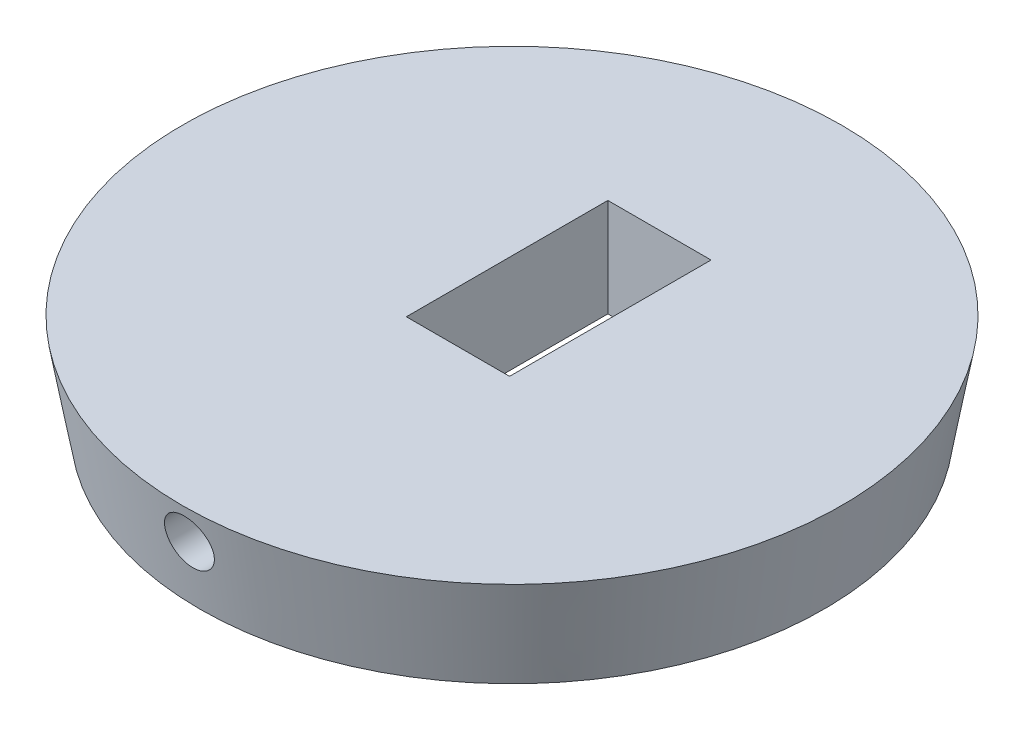
ISO-10303-21;
HEADER;
FILE_DESCRIPTION(('STEP AP214'),'2;1');
FILE_NAME('part.step','',(''),(''),'','','');
FILE_SCHEMA(('AUTOMOTIVE_DESIGN { 1 0 10303 214 1 1 1 1 }'));
ENDSEC;
DATA;
#1=APPLICATION_CONTEXT('core data for automotive mechanical design processes');
#2=APPLICATION_PROTOCOL_DEFINITION('international standard','automotive_design',2000,#1);
#3=PRODUCT_CONTEXT('',#1,'mechanical');
#4=PRODUCT('Part','Part','',(#3));
#5=PRODUCT_RELATED_PRODUCT_CATEGORY('part','',(#4));
#6=PRODUCT_DEFINITION_FORMATION('','',#4);
#7=PRODUCT_DEFINITION_CONTEXT('part definition',#1,'design');
#8=PRODUCT_DEFINITION('design','',#6,#7);
#9=PRODUCT_DEFINITION_SHAPE('','',#8);
#10=(LENGTH_UNIT() NAMED_UNIT(*) SI_UNIT(.MILLI.,.METRE.));
#11=(NAMED_UNIT(*) PLANE_ANGLE_UNIT() SI_UNIT($,.RADIAN.));
#12=(NAMED_UNIT(*) SI_UNIT($,.STERADIAN.) SOLID_ANGLE_UNIT());
#13=UNCERTAINTY_MEASURE_WITH_UNIT(LENGTH_MEASURE(1.E-05),#10,'distance_accuracy_value','');
#14=(GEOMETRIC_REPRESENTATION_CONTEXT(3) GLOBAL_UNCERTAINTY_ASSIGNED_CONTEXT((#13)) GLOBAL_UNIT_ASSIGNED_CONTEXT((#10,
#11,#12)) REPRESENTATION_CONTEXT('',''));
#15=CARTESIAN_POINT('',(0.,0.,0.));
#16=DIRECTION('',(0.,0.,1.));
#17=DIRECTION('',(1.,0.,0.));
#18=AXIS2_PLACEMENT_3D('',#15,#16,#17);
#19=CARTESIAN_POINT('',(0.,20.,0.));
#20=DIRECTION('',(0.,1.,0.));
#21=DIRECTION('',(0.,0.,1.));
#22=AXIS2_PLACEMENT_3D('',#19,#20,#21);
#23=PLANE('',#22);
#24=DIRECTION('',(1.,0.,0.));
#25=VECTOR('',#24,1.);
#26=CARTESIAN_POINT('',(10.5,20.,-30.));
#27=LINE('',#26,#25);
#28=CARTESIAN_POINT('',(-10.5,20.,-30.));
#29=VERTEX_POINT('',#28);
#30=CARTESIAN_POINT('',(10.5,20.,-30.));
#31=VERTEX_POINT('',#30);
#32=EDGE_CURVE('E106',#29,#31,#27,.T.);
#33=ORIENTED_EDGE('',*,*,#32,.F.);
#34=DIRECTION('',(0.,0.,-1.));
#35=VECTOR('',#34,1.);
#36=CARTESIAN_POINT('',(-10.5,20.,-30.));
#37=LINE('',#36,#35);
#38=CARTESIAN_POINT('',(-10.5,20.,11.));
#39=VERTEX_POINT('',#38);
#40=EDGE_CURVE('E46',#39,#29,#37,.T.);
#41=ORIENTED_EDGE('',*,*,#40,.F.);
#42=DIRECTION('',(-1.,0.,0.));
#43=VECTOR('',#42,1.);
#44=CARTESIAN_POINT('',(10.5,20.,11.));
#45=LINE('',#44,#43);
#46=CARTESIAN_POINT('',(10.5,20.,11.));
#47=VERTEX_POINT('',#46);
#48=EDGE_CURVE('E90',#47,#39,#45,.T.);
#49=ORIENTED_EDGE('',*,*,#48,.F.);
#50=DIRECTION('',(0.,0.,1.));
#51=VECTOR('',#50,1.);
#52=CARTESIAN_POINT('',(10.5,20.,-30.));
#53=LINE('',#52,#51);
#54=EDGE_CURVE('E93',#31,#47,#53,.T.);
#55=ORIENTED_EDGE('',*,*,#54,.F.);
#56=EDGE_LOOP('',(#33,#41,#49,#55));
#57=FACE_BOUND('',#56,.T.);
#58=CARTESIAN_POINT('',(0.,20.,0.));
#59=DIRECTION('',(0.,1.,0.));
#60=DIRECTION('',(0.,0.,1.));
#61=AXIS2_PLACEMENT_3D('',#58,#59,#60);
#62=CIRCLE('',#61,63.5265396141693);
#63=CARTESIAN_POINT('',(0.,20.,63.5265396141693));
#64=VERTEX_POINT('',#63);
#65=EDGE_CURVE('E11',#64,#64,#62,.T.);
#66=ORIENTED_EDGE('',*,*,#65,.F.);
#67=EDGE_LOOP('',(#66));
#68=FACE_BOUND('',#67,.T.);
#69=ADVANCED_FACE('F32',(#57,#68),#23,.F.);
#70=CARTESIAN_POINT('',(0.,40.,0.));
#71=DIRECTION('',(0.,1.,0.));
#72=DIRECTION('',(0.,0.,1.));
#73=AXIS2_PLACEMENT_3D('',#70,#71,#72);
#74=PLANE('',#73);
#75=DIRECTION('',(0.,0.,-1.));
#76=VECTOR('',#75,1.);
#77=CARTESIAN_POINT('',(-10.5,40.,-30.));
#78=LINE('',#77,#76);
#79=CARTESIAN_POINT('',(-10.5,40.,11.));
#80=VERTEX_POINT('',#79);
#81=CARTESIAN_POINT('',(-10.5,40.,-30.));
#82=VERTEX_POINT('',#81);
#83=EDGE_CURVE('E74',#80,#82,#78,.T.);
#84=ORIENTED_EDGE('',*,*,#83,.T.);
#85=DIRECTION('',(1.,0.,0.));
#86=VECTOR('',#85,1.);
#87=CARTESIAN_POINT('',(10.5,40.,-30.));
#88=LINE('',#87,#86);
#89=CARTESIAN_POINT('',(10.5,40.,-30.));
#90=VERTEX_POINT('',#89);
#91=EDGE_CURVE('E83',#82,#90,#88,.T.);
#92=ORIENTED_EDGE('',*,*,#91,.T.);
#93=DIRECTION('',(0.,0.,1.));
#94=VECTOR('',#93,1.);
#95=CARTESIAN_POINT('',(10.5,40.,-30.));
#96=LINE('',#95,#94);
#97=CARTESIAN_POINT('',(10.5,40.,11.));
#98=VERTEX_POINT('',#97);
#99=EDGE_CURVE('E54',#90,#98,#96,.T.);
#100=ORIENTED_EDGE('',*,*,#99,.T.);
#101=DIRECTION('',(-1.,0.,0.));
#102=VECTOR('',#101,1.);
#103=CARTESIAN_POINT('',(10.5,40.,11.));
#104=LINE('',#103,#102);
#105=EDGE_CURVE('E80',#98,#80,#104,.T.);
#106=ORIENTED_EDGE('',*,*,#105,.T.);
#107=EDGE_LOOP('',(#84,#92,#100,#106));
#108=FACE_BOUND('',#107,.T.);
#109=CARTESIAN_POINT('',(0.,40.,0.));
#110=DIRECTION('',(0.,1.,0.));
#111=DIRECTION('',(0.,0.,1.));
#112=AXIS2_PLACEMENT_3D('',#109,#110,#111);
#113=CIRCLE('',#112,67.0530792283386);
#114=CARTESIAN_POINT('',(0.,40.,67.0530792283386));
#115=VERTEX_POINT('',#114);
#116=EDGE_CURVE('E39',#115,#115,#113,.T.);
#117=ORIENTED_EDGE('',*,*,#116,.T.);
#118=EDGE_LOOP('',(#117));
#119=FACE_BOUND('',#118,.T.);
#120=ADVANCED_FACE('F87',(#108,#119),#74,.T.);
#121=CARTESIAN_POINT('',(0.,0.,0.));
#122=DIRECTION('',(0.,1.,0.));
#123=DIRECTION('',(0.,0.,1.));
#124=AXIS2_PLACEMENT_3D('',#121,#122,#123);
#125=CONICAL_SURFACE('',#124,60.,0.174532925199433);
#126=CARTESIAN_POINT('',(-2.78851033241423,28.8497939658351,65.0272358088715));
#127=CARTESIAN_POINT('',(-2.90508208404774,28.9281168410592,65.0360602217828));
#128=CARTESIAN_POINT('',(-3.01830048598427,29.0113209778617,65.0455784367397));
#129=CARTESIAN_POINT('',(-3.23729630234493,29.1869158354928,65.066047290349));
#130=CARTESIAN_POINT('',(-3.34307175601884,29.279308961688,65.0769983042977));
#131=CARTESIAN_POINT('',(-3.54648348060132,29.4726548449649,65.1003728895175));
#132=CARTESIAN_POINT('',(-3.64411257068435,29.5736149988459,65.1127977370605));
#133=CARTESIAN_POINT('',(-3.83048548096046,29.7833146290642,65.1391392193604));
#134=CARTESIAN_POINT('',(-3.91922601691366,29.8920569555857,65.1530564016175));
#135=CARTESIAN_POINT('',(-4.08707372866779,30.116351902726,65.1823695066363));
#136=CARTESIAN_POINT('',(-4.16619189488289,30.2318965256721,65.1977637057287));
#137=CARTESIAN_POINT('',(-4.31440968627146,30.4691038683286,65.2300408208212));
#138=CARTESIAN_POINT('',(-4.38350561435521,30.5907688235829,65.2469242825187));
#139=CARTESIAN_POINT('',(-4.5111524562591,30.8392139101521,65.2821351910378));
#140=CARTESIAN_POINT('',(-4.5697097430906,30.9659908929119,65.3004617554693));
#141=CARTESIAN_POINT('',(-4.67597987672862,31.2238616746587,65.3385240691565));
#142=CARTESIAN_POINT('',(-4.72368868452897,31.3549570607051,65.358260339679));
#143=CARTESIAN_POINT('',(-4.80820173513944,31.6212926609856,65.3991864962391));
#144=CARTESIAN_POINT('',(-4.84493785217802,31.7565532435038,65.4203844972727));
#145=CARTESIAN_POINT('',(-4.90691333890568,32.0295365618648,65.4640346312817));
#146=CARTESIAN_POINT('',(-4.93214847401093,32.1672601852176,65.4864872227786));
#147=CARTESIAN_POINT('',(-4.97096827041468,32.4441150461508,65.532509254108));
#148=CARTESIAN_POINT('',(-4.98455608291408,32.583245892691,65.5560783900356));
#149=CARTESIAN_POINT('',(-5.00004661990721,32.8620389821182,65.6042001422329));
#150=CARTESIAN_POINT('',(-5.00194498471529,33.0017014038316,65.6287531220004));
#151=CARTESIAN_POINT('',(-4.99401813884136,33.2824194853571,65.6789979695539));
#152=CARTESIAN_POINT('',(-4.98403573832759,33.4234687859955,65.7047006796101));
#153=CARTESIAN_POINT('',(-4.95218451931214,33.704151272918,65.7567411130998));
#154=CARTESIAN_POINT('',(-4.93031129297351,33.8437839144928,65.7830790685518));
#155=CARTESIAN_POINT('',(-4.87485185852123,34.1205927246559,65.83615475332));
#156=CARTESIAN_POINT('',(-4.84126904052895,34.2577695921596,65.862892364787));
#157=CARTESIAN_POINT('',(-4.76264362958036,34.5287805060149,65.916535474766));
#158=CARTESIAN_POINT('',(-4.7175967808907,34.6626132906539,65.9434410319975));
#159=CARTESIAN_POINT('',(-4.56448462975662,35.0607751988422,66.0246563637464));
#160=CARTESIAN_POINT('',(-4.43906267044216,35.3186977358795,66.0788732075735));
#161=CARTESIAN_POINT('',(-4.14582114334347,35.8096323928559,66.1846519982475));
#162=CARTESIAN_POINT('',(-3.97800056174728,36.0426439169472,66.236213881575));
#163=CARTESIAN_POINT('',(-3.6046064614951,36.4768707177432,66.3342598101621));
#164=CARTESIAN_POINT('',(-3.39908859540329,36.6781320631075,66.3807511817724));
#165=CARTESIAN_POINT('',(-2.9556840587595,37.0430637326132,66.4663805397617));
#166=CARTESIAN_POINT('',(-2.71780089902767,37.2067381288243,66.5055193226168));
#167=CARTESIAN_POINT('',(-2.22140137460985,37.4883360168299,66.5736105294745));
#168=CARTESIAN_POINT('',(-1.96339430437411,37.6071109765643,66.602751447249));
#169=CARTESIAN_POINT('',(-1.43012514830324,37.7994838237586,66.6502618097152));
#170=CARTESIAN_POINT('',(-1.15486621361315,37.8730899351983,66.6686332152058));
#171=CARTESIAN_POINT('',(-0.602950072187026,37.9712048895339,66.6931782958941));
#172=CARTESIAN_POINT('',(-0.326534021144203,37.9969932749065,66.6996697982387));
#173=CARTESIAN_POINT('',(0.226772012514664,38.0025090899721,66.7010556862682));
#174=CARTESIAN_POINT('',(0.503661945147081,37.9822411103845,66.6959512277934));
#175=CARTESIAN_POINT('',(1.04611058962841,37.8969399689945,66.6745918021212));
#176=CARTESIAN_POINT('',(1.31177228968249,37.8325205233964,66.6584897151844));
#177=CARTESIAN_POINT('',(1.8283547446665,37.6616672885739,66.6161848490395));
#178=CARTESIAN_POINT('',(2.07927495735958,37.5552319549871,66.5899816985511));
#179=CARTESIAN_POINT('',(2.56220104353693,37.3023472033357,66.5285360842063));
#180=CARTESIAN_POINT('',(2.79398371137469,37.1554941583408,66.4932026720264));
#181=CARTESIAN_POINT('',(3.22974937037613,36.8266509021402,66.4154106967425));
#182=CARTESIAN_POINT('',(3.43372878343528,36.64465617569,66.3729512181244));
#183=CARTESIAN_POINT('',(3.81373942911824,36.2455001179905,66.2817181422148));
#184=CARTESIAN_POINT('',(3.98890930013581,36.0275496063535,66.2328094196859));
#185=CARTESIAN_POINT('',(4.3003207093692,35.5660776475785,66.1317793836185));
#186=CARTESIAN_POINT('',(4.43655709466449,35.322552821459,66.0796576459402));
#187=CARTESIAN_POINT('',(4.66928519519787,34.8106874865555,65.9731456786486));
#188=CARTESIAN_POINT('',(4.7648025680805,34.5419085678722,65.918730816297));
#189=CARTESIAN_POINT('',(4.908878400596,33.9918429031626,65.8108986238332));
#190=CARTESIAN_POINT('',(4.95743456055308,33.7105555453075,65.7574813426978));
#191=CARTESIAN_POINT('',(5.00619008754204,33.1416102931724,65.6531769112629));
#192=CARTESIAN_POINT('',(5.00610267384639,32.8539246177283,65.6023065343312));
#193=CARTESIAN_POINT('',(4.95650254337009,32.2820746360323,65.504952149167));
#194=CARTESIAN_POINT('',(4.90699227148206,31.9979101562949,65.4584679240811));
#195=CARTESIAN_POINT('',(4.76036139424722,31.4443017161729,65.3714192781582));
#196=CARTESIAN_POINT('',(4.66371577130371,31.1747401006988,65.3308009319521));
#197=CARTESIAN_POINT('',(4.42534482542308,30.6552506078106,65.2555688217381));
#198=CARTESIAN_POINT('',(4.28362295020346,30.4053212306209,65.2209545988095));
#199=CARTESIAN_POINT('',(4.04159632883907,30.0528759638192,65.1739857595638));
#200=CARTESIAN_POINT('',(3.95668360839962,29.9398251722417,65.1592381867813));
#201=CARTESIAN_POINT('',(3.77750179793169,29.7212178055355,65.1312604347483));
#202=CARTESIAN_POINT('',(3.68323635566893,29.6156583359667,65.1180296682162));
#203=CARTESIAN_POINT('',(3.48597116043245,29.4127949489121,65.0930662690903));
#204=CARTESIAN_POINT('',(3.38296847213127,29.3154938280042,65.0813341433169));
#205=CARTESIAN_POINT('',(3.16902555276392,29.1299463367954,65.0593466200588));
#206=CARTESIAN_POINT('',(3.05808835399071,29.0416965384477,65.0490906629003));
#207=CARTESIAN_POINT('',(2.83012008273116,28.8756675577202,65.0301026718843));
#208=CARTESIAN_POINT('',(2.71315617157732,28.7977976669001,65.0213572069158));
#209=CARTESIAN_POINT('',(2.47306620364304,28.6521673929368,65.0052343080482));
#210=CARTESIAN_POINT('',(2.34994250531472,28.5844031795101,64.9978563555716));
#211=CARTESIAN_POINT('',(2.09833072646948,28.4594332859464,64.9844186267047));
#212=CARTESIAN_POINT('',(1.9698409609697,28.4022309533496,64.9783592681285));
#213=CARTESIAN_POINT('',(1.70850176636362,28.2988554120862,64.9675215942823));
#214=CARTESIAN_POINT('',(1.57565397906575,28.2526781029959,64.9627428026631));
#215=CARTESIAN_POINT('',(1.30702383015831,28.1718235319426,64.9544418818804));
#216=CARTESIAN_POINT('',(1.17125472551335,28.137102708221,64.95091498857));
#217=CARTESIAN_POINT('',(0.897307952354535,28.0791838633059,64.9450634480941));
#218=CARTESIAN_POINT('',(0.759131201302552,28.0559815481217,64.9427383528963));
#219=CARTESIAN_POINT('',(0.481219681327322,28.0212401264759,64.9392663973941));
#220=CARTESIAN_POINT('',(0.341484022219075,28.0097080692861,64.9381202492109));
#221=CARTESIAN_POINT('',(0.061584919995677,27.9984184612174,64.9369981339893));
#222=CARTESIAN_POINT('',(-0.0785783462666395,27.9986565676924,64.9370217353675));
#223=CARTESIAN_POINT('',(-0.358349653272792,28.0108932960714,64.9382381256707));
#224=CARTESIAN_POINT('',(-0.497957827036794,28.0228889056094,64.9394306151173));
#225=CARTESIAN_POINT('',(-0.775609292044648,28.0585412985321,64.9429947909867));
#226=CARTESIAN_POINT('',(-0.913653137439742,28.0821938114777,64.9453660455786));
#227=CARTESIAN_POINT('',(-1.18713037835002,28.1409606523645,64.9513064378997));
#228=CARTESIAN_POINT('',(-1.32256592791681,28.1760650515318,64.9548745380405));
#229=CARTESIAN_POINT('',(-1.5899433061433,28.2574679956111,64.9632376836027));
#230=CARTESIAN_POINT('',(-1.72188601948925,28.30376367524,64.9680324149901));
#231=CARTESIAN_POINT('',(-2.01602424824757,28.4210323503195,64.9803355537022));
#232=CARTESIAN_POINT('',(-2.17690416908681,28.4952938259573,64.9882266508871));
#233=CARTESIAN_POINT('',(-2.48979644482218,28.6603913119325,65.0061241684395));
#234=CARTESIAN_POINT('',(-2.64180879819064,28.7512273251252,65.0161305891715));
#235=CARTESIAN_POINT('',(-2.78851033241423,28.8497939658351,65.0272358088715));
#236=B_SPLINE_CURVE_WITH_KNOTS('',3,(#126,#127,#128,#129,#130,#131,#132,#133,#134,#135,#136,
#137,#138,#139,#140,#141,#142,#143,#144,#145,#146,#147,#148,#149,#150,#151,#152,#153,#154,#155,
#156,#157,#158,#159,#160,#161,#162,#163,#164,#165,#166,#167,#168,#169,#170,#171,#172,#173,#174,
#175,#176,#177,#178,#179,#180,#181,#182,#183,#184,#185,#186,#187,#188,#189,#190,#191,#192,#193,
#194,#195,#196,#197,#198,#199,#200,#201,#202,#203,#204,#205,#206,#207,#208,#209,#210,#211,#212,
#213,#214,#215,#216,#217,#218,#219,#220,#221,#222,#223,#224,#225,#226,#227,#228,#229,#230,#231,
#232,#233,#234,#235),.UNSPECIFIED.,.T.,.F.,(4,2,2,2,2,2,2,2,2,2,2,2,2,2,2,2,2,2,2,2,2,2,2,2,2,2,
2,2,2,2,2,2,2,2,2,2,2,2,2,2,2,2,2,2,2,2,2,2,2,2,2,2,2,2,4),(0.,0.421995430551853,
0.8441016174365,1.26657603448055,1.68920598056002,2.11134858400232,2.53364651715919,
2.9556882104963,3.37788677818432,3.80265460681158,4.22757870598362,4.65238780497375,
5.07735533078307,5.50800850839814,5.93882143477274,6.36950973706856,6.80035815539015,
7.67149643750117,8.54265555175171,9.41253877482578,10.2823277125742,11.1346782738741,
11.9868735999752,12.8159165482305,13.6448768643326,14.4625420832806,15.2802373596428,
16.1064148742003,16.9326986124374,17.7803975217069,18.6282085736263,19.4953006885454,
20.3624352625425,21.2346821275278,22.1068858455902,22.9704765100161,23.8340011374314,
24.2600478211535,24.6859289857362,25.1119537985215,25.5378166605929,25.9596724288634,
26.3813678955059,26.8031967880402,27.2248685488395,27.6449179690886,28.0648106810916,
28.4849568728596,28.9049480512683,29.3248316527099,29.744561546442,30.1639284976436,
30.5831881925987,31.1142548152127,31.6453215293162),.UNSPECIFIED.);
#237=CARTESIAN_POINT('',(-2.78851033241423,28.8497939658351,65.0272358088715));
#238=VERTEX_POINT('',#237);
#239=EDGE_CURVE('E96',#238,#238,#236,.T.);
#240=ORIENTED_EDGE('',*,*,#239,.T.);
#241=EDGE_LOOP('',(#240));
#242=FACE_BOUND('',#241,.T.);
#243=ORIENTED_EDGE('',*,*,#65,.T.);
#244=EDGE_LOOP('',(#243));
#245=FACE_BOUND('',#244,.T.);
#246=ORIENTED_EDGE('',*,*,#116,.F.);
#247=EDGE_LOOP('',(#246));
#248=FACE_BOUND('',#247,.T.);
#249=ADVANCED_FACE('F117',(#242,#245,#248),#125,.T.);
#250=CARTESIAN_POINT('',(-10.5,40.,-30.));
#251=DIRECTION('',(-1.,0.,0.));
#252=DIRECTION('',(0.,0.,1.));
#253=AXIS2_PLACEMENT_3D('',#250,#251,#252);
#254=PLANE('',#253);
#255=ORIENTED_EDGE('',*,*,#40,.T.);
#256=DIRECTION('',(0.,-1.,0.));
#257=VECTOR('',#256,1.);
#258=CARTESIAN_POINT('',(-10.5,40.,-30.));
#259=LINE('',#258,#257);
#260=EDGE_CURVE('E70',#82,#29,#259,.T.);
#261=ORIENTED_EDGE('',*,*,#260,.F.);
#262=ORIENTED_EDGE('',*,*,#83,.F.);
#263=DIRECTION('',(0.,-1.,0.));
#264=VECTOR('',#263,1.);
#265=CARTESIAN_POINT('',(-10.5,40.,11.));
#266=LINE('',#265,#264);
#267=EDGE_CURVE('E110',#80,#39,#266,.T.);
#268=ORIENTED_EDGE('',*,*,#267,.T.);
#269=EDGE_LOOP('',(#255,#261,#262,#268));
#270=FACE_BOUND('',#269,.T.);
#271=ADVANCED_FACE('F72',(#270),#254,.F.);
#272=CARTESIAN_POINT('',(10.5,40.,11.));
#273=DIRECTION('',(0.,0.,1.));
#274=DIRECTION('',(1.,0.,0.));
#275=AXIS2_PLACEMENT_3D('',#272,#273,#274);
#276=PLANE('',#275);
#277=CARTESIAN_POINT('',(0.,33.,11.));
#278=DIRECTION('',(0.,0.,-1.));
#279=DIRECTION('',(-1.,0.,0.));
#280=AXIS2_PLACEMENT_3D('',#277,#278,#279);
#281=CIRCLE('',#280,5.);
#282=CARTESIAN_POINT('',(-5.,33.,11.));
#283=VERTEX_POINT('',#282);
#284=EDGE_CURVE('E160',#283,#283,#281,.T.);
#285=ORIENTED_EDGE('',*,*,#284,.F.);
#286=EDGE_LOOP('',(#285));
#287=FACE_BOUND('',#286,.T.);
#288=ORIENTED_EDGE('',*,*,#48,.T.);
#289=ORIENTED_EDGE('',*,*,#267,.F.);
#290=ORIENTED_EDGE('',*,*,#105,.F.);
#291=DIRECTION('',(0.,-1.,0.));
#292=VECTOR('',#291,1.);
#293=CARTESIAN_POINT('',(10.5,40.,11.));
#294=LINE('',#293,#292);
#295=EDGE_CURVE('E112',#98,#47,#294,.T.);
#296=ORIENTED_EDGE('',*,*,#295,.T.);
#297=EDGE_LOOP('',(#288,#289,#290,#296));
#298=FACE_BOUND('',#297,.T.);
#299=ADVANCED_FACE('F124',(#287,#298),#276,.F.);
#300=CARTESIAN_POINT('',(10.5,40.,-30.));
#301=DIRECTION('',(1.,0.,0.));
#302=DIRECTION('',(0.,0.,-1.));
#303=AXIS2_PLACEMENT_3D('',#300,#301,#302);
#304=PLANE('',#303);
#305=ORIENTED_EDGE('',*,*,#54,.T.);
#306=ORIENTED_EDGE('',*,*,#295,.F.);
#307=ORIENTED_EDGE('',*,*,#99,.F.);
#308=DIRECTION('',(0.,-1.,0.));
#309=VECTOR('',#308,1.);
#310=CARTESIAN_POINT('',(10.5,40.,-30.));
#311=LINE('',#310,#309);
#312=EDGE_CURVE('E79',#90,#31,#311,.T.);
#313=ORIENTED_EDGE('',*,*,#312,.T.);
#314=EDGE_LOOP('',(#305,#306,#307,#313));
#315=FACE_BOUND('',#314,.T.);
#316=ADVANCED_FACE('F138',(#315),#304,.F.);
#317=CARTESIAN_POINT('',(10.5,40.,-30.));
#318=DIRECTION('',(0.,0.,-1.));
#319=DIRECTION('',(-1.,0.,0.));
#320=AXIS2_PLACEMENT_3D('',#317,#318,#319);
#321=PLANE('',#320);
#322=ORIENTED_EDGE('',*,*,#32,.T.);
#323=ORIENTED_EDGE('',*,*,#312,.F.);
#324=ORIENTED_EDGE('',*,*,#91,.F.);
#325=ORIENTED_EDGE('',*,*,#260,.T.);
#326=EDGE_LOOP('',(#322,#323,#324,#325));
#327=FACE_BOUND('',#326,.T.);
#328=ADVANCED_FACE('F84',(#327),#321,.F.);
#329=CARTESIAN_POINT('',(0.,33.,124.));
#330=DIRECTION('',(0.,0.,-1.));
#331=DIRECTION('',(-1.,0.,0.));
#332=AXIS2_PLACEMENT_3D('',#329,#330,#331);
#333=CYLINDRICAL_SURFACE('',#332,5.);
#334=ORIENTED_EDGE('',*,*,#284,.T.);
#335=EDGE_LOOP('',(#334));
#336=FACE_BOUND('',#335,.T.);
#337=ORIENTED_EDGE('',*,*,#239,.F.);
#338=EDGE_LOOP('',(#337));
#339=FACE_BOUND('',#338,.T.);
#340=ADVANCED_FACE('F148',(#336,#339),#333,.F.);
#341=CLOSED_SHELL('',(#69,#120,#249,#271,#299,#316,#328,#340));
#342=MANIFOLD_SOLID_BREP('B2',#341);
#343=ADVANCED_BREP_SHAPE_REPRESENTATION('',(#18,#342),#14);
#344=SHAPE_DEFINITION_REPRESENTATION(#9,#343);
ENDSEC;
END-ISO-10303-21;
